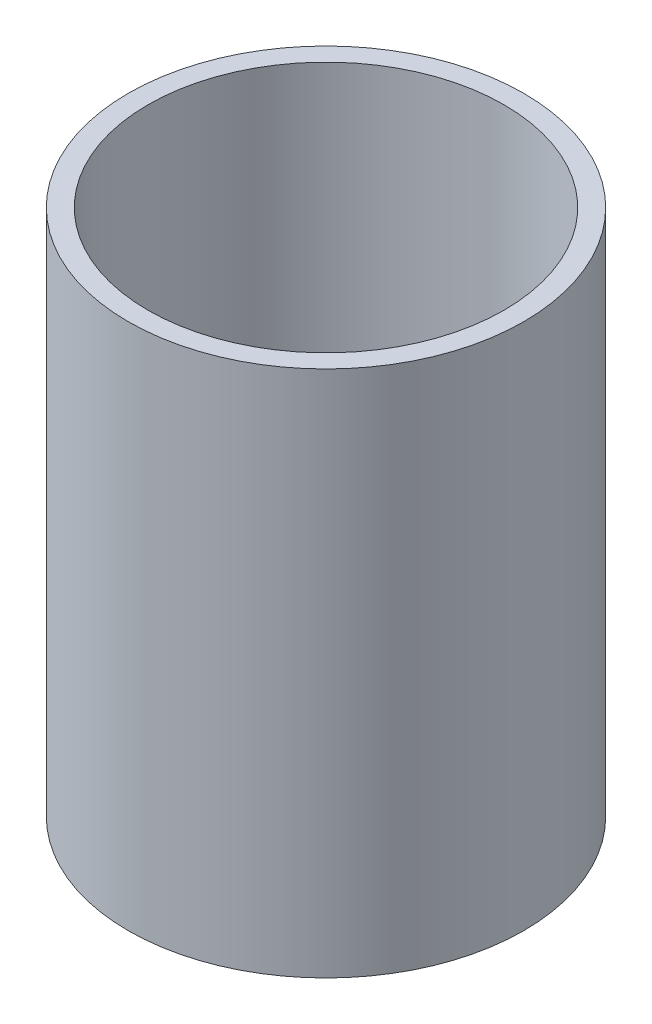
ISO-10303-21;
HEADER;
FILE_DESCRIPTION(('STEP AP214'),'2;1');
FILE_NAME('part.step','',(''),(''),'','','');
FILE_SCHEMA(('AUTOMOTIVE_DESIGN { 1 0 10303 214 1 1 1 1 }'));
ENDSEC;
DATA;
#1=APPLICATION_CONTEXT('core data for automotive mechanical design processes');
#2=APPLICATION_PROTOCOL_DEFINITION('international standard','automotive_design',2000,#1);
#3=PRODUCT_CONTEXT('',#1,'mechanical');
#4=PRODUCT('Part','Part','',(#3));
#5=PRODUCT_RELATED_PRODUCT_CATEGORY('part','',(#4));
#6=PRODUCT_DEFINITION_FORMATION('','',#4);
#7=PRODUCT_DEFINITION_CONTEXT('part definition',#1,'design');
#8=PRODUCT_DEFINITION('design','',#6,#7);
#9=PRODUCT_DEFINITION_SHAPE('','',#8);
#10=(LENGTH_UNIT() NAMED_UNIT(*) SI_UNIT(.MILLI.,.METRE.));
#11=(NAMED_UNIT(*) PLANE_ANGLE_UNIT() SI_UNIT($,.RADIAN.));
#12=(NAMED_UNIT(*) SI_UNIT($,.STERADIAN.) SOLID_ANGLE_UNIT());
#13=UNCERTAINTY_MEASURE_WITH_UNIT(LENGTH_MEASURE(1.E-05),#10,'distance_accuracy_value','');
#14=(GEOMETRIC_REPRESENTATION_CONTEXT(3) GLOBAL_UNCERTAINTY_ASSIGNED_CONTEXT((#13)) GLOBAL_UNIT_ASSIGNED_CONTEXT((#10,
#11,#12)) REPRESENTATION_CONTEXT('',''));
#15=CARTESIAN_POINT('',(0.,0.,0.));
#16=DIRECTION('',(0.,0.,1.));
#17=DIRECTION('',(1.,0.,0.));
#18=AXIS2_PLACEMENT_3D('',#15,#16,#17);
#19=CARTESIAN_POINT('',(0.,80.,0.));
#20=DIRECTION('',(0.,1.,0.));
#21=DIRECTION('',(0.,0.,1.));
#22=AXIS2_PLACEMENT_3D('',#19,#20,#21);
#23=PLANE('',#22);
#24=CARTESIAN_POINT('',(0.,80.,0.));
#25=DIRECTION('',(0.,1.,0.));
#26=DIRECTION('',(0.,0.,1.));
#27=AXIS2_PLACEMENT_3D('',#24,#25,#26);
#28=CIRCLE('',#27,30.);
#29=CARTESIAN_POINT('',(0.,80.,30.));
#30=VERTEX_POINT('',#29);
#31=EDGE_CURVE('E10',#30,#30,#28,.T.);
#32=ORIENTED_EDGE('',*,*,#31,.T.);
#33=EDGE_LOOP('',(#32));
#34=FACE_BOUND('',#33,.T.);
#35=CARTESIAN_POINT('',(0.,80.,0.));
#36=DIRECTION('',(0.,1.,0.));
#37=DIRECTION('',(0.,0.,1.));
#38=AXIS2_PLACEMENT_3D('',#35,#36,#37);
#39=CIRCLE('',#38,27.);
#40=CARTESIAN_POINT('',(0.,80.,27.));
#41=VERTEX_POINT('',#40);
#42=EDGE_CURVE('E42',#41,#41,#39,.T.);
#43=ORIENTED_EDGE('',*,*,#42,.F.);
#44=EDGE_LOOP('',(#43));
#45=FACE_BOUND('',#44,.T.);
#46=ADVANCED_FACE('F31',(#34,#45),#23,.T.);
#47=CARTESIAN_POINT('',(0.,0.,0.));
#48=DIRECTION('',(0.,1.,0.));
#49=DIRECTION('',(0.,0.,1.));
#50=AXIS2_PLACEMENT_3D('',#47,#48,#49);
#51=PLANE('',#50);
#52=CARTESIAN_POINT('',(0.,0.,0.));
#53=DIRECTION('',(0.,1.,0.));
#54=DIRECTION('',(0.,0.,1.));
#55=AXIS2_PLACEMENT_3D('',#52,#53,#54);
#56=CIRCLE('',#55,30.);
#57=CARTESIAN_POINT('',(0.,0.,30.));
#58=VERTEX_POINT('',#57);
#59=EDGE_CURVE('E35',#58,#58,#56,.T.);
#60=ORIENTED_EDGE('',*,*,#59,.F.);
#61=EDGE_LOOP('',(#60));
#62=FACE_BOUND('',#61,.T.);
#63=CARTESIAN_POINT('',(0.,0.,0.));
#64=DIRECTION('',(0.,1.,0.));
#65=DIRECTION('',(0.,0.,1.));
#66=AXIS2_PLACEMENT_3D('',#63,#64,#65);
#67=CIRCLE('',#66,27.);
#68=CARTESIAN_POINT('',(0.,0.,27.));
#69=VERTEX_POINT('',#68);
#70=EDGE_CURVE('E44',#69,#69,#67,.T.);
#71=ORIENTED_EDGE('',*,*,#70,.T.);
#72=EDGE_LOOP('',(#71));
#73=FACE_BOUND('',#72,.T.);
#74=ADVANCED_FACE('F54',(#62,#73),#51,.F.);
#75=CARTESIAN_POINT('',(0.,80.,0.));
#76=DIRECTION('',(0.,-1.,0.));
#77=DIRECTION('',(0.,0.,-1.));
#78=AXIS2_PLACEMENT_3D('',#75,#76,#77);
#79=CYLINDRICAL_SURFACE('',#78,30.);
#80=ORIENTED_EDGE('',*,*,#31,.F.);
#81=EDGE_LOOP('',(#80));
#82=FACE_BOUND('',#81,.T.);
#83=ORIENTED_EDGE('',*,*,#59,.T.);
#84=EDGE_LOOP('',(#83));
#85=FACE_BOUND('',#84,.T.);
#86=ADVANCED_FACE('F33',(#82,#85),#79,.T.);
#87=CARTESIAN_POINT('',(0.,80.,0.));
#88=DIRECTION('',(0.,-1.,0.));
#89=DIRECTION('',(0.,0.,-1.));
#90=AXIS2_PLACEMENT_3D('',#87,#88,#89);
#91=CYLINDRICAL_SURFACE('',#90,27.);
#92=ORIENTED_EDGE('',*,*,#42,.T.);
#93=EDGE_LOOP('',(#92));
#94=FACE_BOUND('',#93,.T.);
#95=ORIENTED_EDGE('',*,*,#70,.F.);
#96=EDGE_LOOP('',(#95));
#97=FACE_BOUND('',#96,.T.);
#98=ADVANCED_FACE('F50',(#94,#97),#91,.F.);
#99=CLOSED_SHELL('',(#46,#74,#86,#98));
#100=MANIFOLD_SOLID_BREP('B2',#99);
#101=ADVANCED_BREP_SHAPE_REPRESENTATION('',(#18,#100),#14);
#102=SHAPE_DEFINITION_REPRESENTATION(#9,#101);
ENDSEC;
END-ISO-10303-21;
